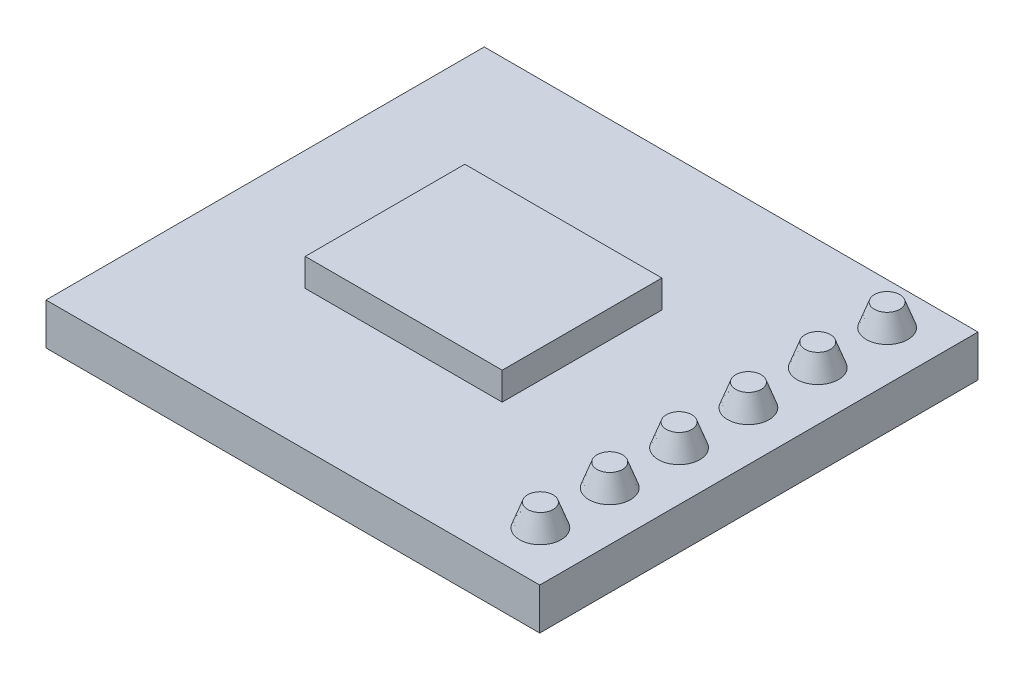
ISO-10303-21;
HEADER;
FILE_DESCRIPTION(('STEP AP214'),'2;1');
FILE_NAME('part.step','',(''),(''),'','','');
FILE_SCHEMA(('AUTOMOTIVE_DESIGN { 1 0 10303 214 1 1 1 1 }'));
ENDSEC;
DATA;
#1=APPLICATION_CONTEXT('core data for automotive mechanical design processes');
#2=APPLICATION_PROTOCOL_DEFINITION('international standard','automotive_design',2000,#1);
#3=PRODUCT_CONTEXT('',#1,'mechanical');
#4=PRODUCT('Part','Part','',(#3));
#5=PRODUCT_RELATED_PRODUCT_CATEGORY('part','',(#4));
#6=PRODUCT_DEFINITION_FORMATION('','',#4);
#7=PRODUCT_DEFINITION_CONTEXT('part definition',#1,'design');
#8=PRODUCT_DEFINITION('design','',#6,#7);
#9=PRODUCT_DEFINITION_SHAPE('','',#8);
#10=(LENGTH_UNIT() NAMED_UNIT(*) SI_UNIT(.MILLI.,.METRE.));
#11=(NAMED_UNIT(*) PLANE_ANGLE_UNIT() SI_UNIT($,.RADIAN.));
#12=(NAMED_UNIT(*) SI_UNIT($,.STERADIAN.) SOLID_ANGLE_UNIT());
#13=UNCERTAINTY_MEASURE_WITH_UNIT(LENGTH_MEASURE(1.E-05),#10,'distance_accuracy_value','');
#14=(GEOMETRIC_REPRESENTATION_CONTEXT(3) GLOBAL_UNCERTAINTY_ASSIGNED_CONTEXT((#13)) GLOBAL_UNIT_ASSIGNED_CONTEXT((#10,
#11,#12)) REPRESENTATION_CONTEXT('',''));
#15=CARTESIAN_POINT('',(0.,0.,0.));
#16=DIRECTION('',(0.,0.,1.));
#17=DIRECTION('',(1.,0.,0.));
#18=AXIS2_PLACEMENT_3D('',#15,#16,#17);
#19=CARTESIAN_POINT('',(8.9,1.5,-7.9));
#20=DIRECTION('',(-1.,0.,0.));
#21=DIRECTION('',(0.,0.,1.));
#22=AXIS2_PLACEMENT_3D('',#19,#20,#21);
#23=PLANE('',#22);
#24=DIRECTION('',(0.,0.,-1.));
#25=VECTOR('',#24,1.);
#26=CARTESIAN_POINT('',(8.9,0.,-7.9));
#27=LINE('',#26,#25);
#28=CARTESIAN_POINT('',(8.9,0.,7.9));
#29=VERTEX_POINT('',#28);
#30=CARTESIAN_POINT('',(8.9,0.,-7.9));
#31=VERTEX_POINT('',#30);
#32=EDGE_CURVE('E127',#29,#31,#27,.T.);
#33=ORIENTED_EDGE('',*,*,#32,.T.);
#34=DIRECTION('',(0.,-1.,0.));
#35=VECTOR('',#34,1.);
#36=CARTESIAN_POINT('',(8.9,1.5,-7.9));
#37=LINE('',#36,#35);
#38=CARTESIAN_POINT('',(8.9,1.5,-7.9));
#39=VERTEX_POINT('',#38);
#40=EDGE_CURVE('E11',#39,#31,#37,.T.);
#41=ORIENTED_EDGE('',*,*,#40,.F.);
#42=DIRECTION('',(0.,0.,-1.));
#43=VECTOR('',#42,1.);
#44=CARTESIAN_POINT('',(8.9,1.5,-7.9));
#45=LINE('',#44,#43);
#46=CARTESIAN_POINT('',(8.9,1.5,7.9));
#47=VERTEX_POINT('',#46);
#48=EDGE_CURVE('E138',#47,#39,#45,.T.);
#49=ORIENTED_EDGE('',*,*,#48,.F.);
#50=DIRECTION('',(0.,-1.,0.));
#51=VECTOR('',#50,1.);
#52=CARTESIAN_POINT('',(8.9,1.5,7.9));
#53=LINE('',#52,#51);
#54=EDGE_CURVE('E151',#47,#29,#53,.T.);
#55=ORIENTED_EDGE('',*,*,#54,.T.);
#56=EDGE_LOOP('',(#33,#41,#49,#55));
#57=FACE_BOUND('',#56,.T.);
#58=ADVANCED_FACE('F39',(#57),#23,.F.);
#59=CARTESIAN_POINT('',(-8.9,1.5,-7.9));
#60=DIRECTION('',(0.,0.,1.));
#61=DIRECTION('',(1.,0.,0.));
#62=AXIS2_PLACEMENT_3D('',#59,#60,#61);
#63=PLANE('',#62);
#64=DIRECTION('',(-1.,0.,0.));
#65=VECTOR('',#64,1.);
#66=CARTESIAN_POINT('',(-8.9,0.,-7.9));
#67=LINE('',#66,#65);
#68=CARTESIAN_POINT('',(-8.9,0.,-7.9));
#69=VERTEX_POINT('',#68);
#70=EDGE_CURVE('E132',#31,#69,#67,.T.);
#71=ORIENTED_EDGE('',*,*,#70,.T.);
#72=DIRECTION('',(0.,-1.,0.));
#73=VECTOR('',#72,1.);
#74=CARTESIAN_POINT('',(-8.9,1.5,-7.9));
#75=LINE('',#74,#73);
#76=CARTESIAN_POINT('',(-8.9,1.5,-7.9));
#77=VERTEX_POINT('',#76);
#78=EDGE_CURVE('E47',#77,#69,#75,.T.);
#79=ORIENTED_EDGE('',*,*,#78,.F.);
#80=DIRECTION('',(-1.,0.,0.));
#81=VECTOR('',#80,1.);
#82=CARTESIAN_POINT('',(-8.9,1.5,-7.9));
#83=LINE('',#82,#81);
#84=EDGE_CURVE('E142',#39,#77,#83,.T.);
#85=ORIENTED_EDGE('',*,*,#84,.F.);
#86=ORIENTED_EDGE('',*,*,#40,.T.);
#87=EDGE_LOOP('',(#71,#79,#85,#86));
#88=FACE_BOUND('',#87,.T.);
#89=ADVANCED_FACE('F188',(#88),#63,.F.);
#90=CARTESIAN_POINT('',(-8.9,1.5,-7.9));
#91=DIRECTION('',(1.,0.,0.));
#92=DIRECTION('',(0.,0.,-1.));
#93=AXIS2_PLACEMENT_3D('',#90,#91,#92);
#94=PLANE('',#93);
#95=DIRECTION('',(0.,0.,1.));
#96=VECTOR('',#95,1.);
#97=CARTESIAN_POINT('',(-8.9,0.,-7.9));
#98=LINE('',#97,#96);
#99=CARTESIAN_POINT('',(-8.9,0.,7.9));
#100=VERTEX_POINT('',#99);
#101=EDGE_CURVE('E155',#69,#100,#98,.T.);
#102=ORIENTED_EDGE('',*,*,#101,.T.);
#103=DIRECTION('',(0.,-1.,0.));
#104=VECTOR('',#103,1.);
#105=CARTESIAN_POINT('',(-8.9,1.5,7.9));
#106=LINE('',#105,#104);
#107=CARTESIAN_POINT('',(-8.9,1.5,7.9));
#108=VERTEX_POINT('',#107);
#109=EDGE_CURVE('E163',#108,#100,#106,.T.);
#110=ORIENTED_EDGE('',*,*,#109,.F.);
#111=DIRECTION('',(0.,0.,1.));
#112=VECTOR('',#111,1.);
#113=CARTESIAN_POINT('',(-8.9,1.5,-7.9));
#114=LINE('',#113,#112);
#115=EDGE_CURVE('E146',#77,#108,#114,.T.);
#116=ORIENTED_EDGE('',*,*,#115,.F.);
#117=ORIENTED_EDGE('',*,*,#78,.T.);
#118=EDGE_LOOP('',(#102,#110,#116,#117));
#119=FACE_BOUND('',#118,.T.);
#120=ADVANCED_FACE('F172',(#119),#94,.F.);
#121=CARTESIAN_POINT('',(-8.9,1.5,7.9));
#122=DIRECTION('',(0.,0.,-1.));
#123=DIRECTION('',(-1.,0.,0.));
#124=AXIS2_PLACEMENT_3D('',#121,#122,#123);
#125=PLANE('',#124);
#126=DIRECTION('',(1.,0.,0.));
#127=VECTOR('',#126,1.);
#128=CARTESIAN_POINT('',(-8.9,0.,7.9));
#129=LINE('',#128,#127);
#130=EDGE_CURVE('E143',#100,#29,#129,.T.);
#131=ORIENTED_EDGE('',*,*,#130,.T.);
#132=ORIENTED_EDGE('',*,*,#54,.F.);
#133=DIRECTION('',(1.,0.,0.));
#134=VECTOR('',#133,1.);
#135=CARTESIAN_POINT('',(-8.9,1.5,7.9));
#136=LINE('',#135,#134);
#137=EDGE_CURVE('E149',#108,#47,#136,.T.);
#138=ORIENTED_EDGE('',*,*,#137,.F.);
#139=ORIENTED_EDGE('',*,*,#109,.T.);
#140=EDGE_LOOP('',(#131,#132,#138,#139));
#141=FACE_BOUND('',#140,.T.);
#142=ADVANCED_FACE('F181',(#141),#125,.F.);
#143=CARTESIAN_POINT('',(0.,1.5,0.));
#144=DIRECTION('',(0.,1.,0.));
#145=DIRECTION('',(0.,0.,1.));
#146=AXIS2_PLACEMENT_3D('',#143,#144,#145);
#147=PLANE('',#146);
#148=CARTESIAN_POINT('',(7.12329912022585,1.5,6.1));
#149=DIRECTION('',(0.,1.,0.));
#150=DIRECTION('',(0.,0.,1.));
#151=AXIS2_PLACEMENT_3D('',#148,#149,#150);
#152=CIRCLE('',#151,0.75);
#153=CARTESIAN_POINT('',(7.12329912022585,1.5,6.85));
#154=VERTEX_POINT('',#153);
#155=EDGE_CURVE('E271',#154,#154,#152,.T.);
#156=ORIENTED_EDGE('',*,*,#155,.F.);
#157=EDGE_LOOP('',(#156));
#158=FACE_BOUND('',#157,.T.);
#159=CARTESIAN_POINT('',(7.12329912022585,1.5,3.6));
#160=DIRECTION('',(0.,1.,0.));
#161=DIRECTION('',(0.,0.,1.));
#162=AXIS2_PLACEMENT_3D('',#159,#160,#161);
#163=CIRCLE('',#162,0.75);
#164=CARTESIAN_POINT('',(7.12329912022585,1.5,4.35));
#165=VERTEX_POINT('',#164);
#166=EDGE_CURVE('E270',#165,#165,#163,.T.);
#167=ORIENTED_EDGE('',*,*,#166,.F.);
#168=EDGE_LOOP('',(#167));
#169=FACE_BOUND('',#168,.T.);
#170=CARTESIAN_POINT('',(7.12329912022585,1.5,1.1));
#171=DIRECTION('',(0.,1.,0.));
#172=DIRECTION('',(0.,0.,1.));
#173=AXIS2_PLACEMENT_3D('',#170,#171,#172);
#174=CIRCLE('',#173,0.75);
#175=CARTESIAN_POINT('',(7.12329912022585,1.5,1.85));
#176=VERTEX_POINT('',#175);
#177=EDGE_CURVE('E284',#176,#176,#174,.T.);
#178=ORIENTED_EDGE('',*,*,#177,.F.);
#179=EDGE_LOOP('',(#178));
#180=FACE_BOUND('',#179,.T.);
#181=CARTESIAN_POINT('',(7.12329912022585,1.5,-1.4));
#182=DIRECTION('',(0.,1.,0.));
#183=DIRECTION('',(0.,0.,1.));
#184=AXIS2_PLACEMENT_3D('',#181,#182,#183);
#185=CIRCLE('',#184,0.75);
#186=CARTESIAN_POINT('',(7.12329912022585,1.5,-0.650000000000001));
#187=VERTEX_POINT('',#186);
#188=EDGE_CURVE('E292',#187,#187,#185,.T.);
#189=ORIENTED_EDGE('',*,*,#188,.F.);
#190=EDGE_LOOP('',(#189));
#191=FACE_BOUND('',#190,.T.);
#192=CARTESIAN_POINT('',(7.12329912022585,1.5,-3.9));
#193=DIRECTION('',(0.,1.,0.));
#194=DIRECTION('',(0.,0.,1.));
#195=AXIS2_PLACEMENT_3D('',#192,#193,#194);
#196=CIRCLE('',#195,0.75);
#197=CARTESIAN_POINT('',(7.12329912022585,1.5,-3.15));
#198=VERTEX_POINT('',#197);
#199=EDGE_CURVE('E300',#198,#198,#196,.T.);
#200=ORIENTED_EDGE('',*,*,#199,.F.);
#201=EDGE_LOOP('',(#200));
#202=FACE_BOUND('',#201,.T.);
#203=CARTESIAN_POINT('',(7.12329912022585,1.5,-6.4));
#204=DIRECTION('',(0.,1.,0.));
#205=DIRECTION('',(0.,0.,1.));
#206=AXIS2_PLACEMENT_3D('',#203,#204,#205);
#207=CIRCLE('',#206,0.75);
#208=CARTESIAN_POINT('',(7.12329912022585,1.5,-5.65));
#209=VERTEX_POINT('',#208);
#210=EDGE_CURVE('E308',#209,#209,#207,.T.);
#211=ORIENTED_EDGE('',*,*,#210,.F.);
#212=EDGE_LOOP('',(#211));
#213=FACE_BOUND('',#212,.T.);
#214=DIRECTION('',(0.,0.,1.));
#215=VECTOR('',#214,1.);
#216=CARTESIAN_POINT('',(-4.58788756895902,1.5,-2.88755204449834));
#217=LINE('',#216,#215);
#218=CARTESIAN_POINT('',(-4.58788756895902,1.5,-2.88755204449834));
#219=VERTEX_POINT('',#218);
#220=CARTESIAN_POINT('',(-4.58788756895902,1.5,2.86742973059938));
#221=VERTEX_POINT('',#220);
#222=EDGE_CURVE('E54',#219,#221,#217,.T.);
#223=ORIENTED_EDGE('',*,*,#222,.F.);
#224=DIRECTION('',(-1.,0.,0.));
#225=VECTOR('',#224,1.);
#226=CARTESIAN_POINT('',(-4.58788756895902,1.5,-2.88755204449834));
#227=LINE('',#226,#225);
#228=CARTESIAN_POINT('',(2.51528923736789,1.5,-2.88755204449834));
#229=VERTEX_POINT('',#228);
#230=EDGE_CURVE('E58',#229,#219,#227,.T.);
#231=ORIENTED_EDGE('',*,*,#230,.F.);
#232=DIRECTION('',(0.,0.,-1.));
#233=VECTOR('',#232,1.);
#234=CARTESIAN_POINT('',(2.51528923736789,1.5,-2.88755204449834));
#235=LINE('',#234,#233);
#236=CARTESIAN_POINT('',(2.51528923736789,1.5,2.86742973059938));
#237=VERTEX_POINT('',#236);
#238=EDGE_CURVE('E326',#237,#229,#235,.T.);
#239=ORIENTED_EDGE('',*,*,#238,.F.);
#240=DIRECTION('',(1.,0.,0.));
#241=VECTOR('',#240,1.);
#242=CARTESIAN_POINT('',(-4.58788756895902,1.5,2.86742973059938));
#243=LINE('',#242,#241);
#244=EDGE_CURVE('E323',#221,#237,#243,.T.);
#245=ORIENTED_EDGE('',*,*,#244,.F.);
#246=EDGE_LOOP('',(#223,#231,#239,#245));
#247=FACE_BOUND('',#246,.T.);
#248=ORIENTED_EDGE('',*,*,#48,.T.);
#249=ORIENTED_EDGE('',*,*,#84,.T.);
#250=ORIENTED_EDGE('',*,*,#115,.T.);
#251=ORIENTED_EDGE('',*,*,#137,.T.);
#252=EDGE_LOOP('',(#248,#249,#250,#251));
#253=FACE_BOUND('',#252,.T.);
#254=ADVANCED_FACE('F187',(#158,#169,#180,#191,#202,#213,#247,#253),#147,.T.);
#255=CARTESIAN_POINT('',(0.,0.,0.));
#256=DIRECTION('',(0.,1.,0.));
#257=DIRECTION('',(0.,0.,1.));
#258=AXIS2_PLACEMENT_3D('',#255,#256,#257);
#259=PLANE('',#258);
#260=ORIENTED_EDGE('',*,*,#32,.F.);
#261=ORIENTED_EDGE('',*,*,#130,.F.);
#262=ORIENTED_EDGE('',*,*,#101,.F.);
#263=ORIENTED_EDGE('',*,*,#70,.F.);
#264=EDGE_LOOP('',(#260,#261,#262,#263));
#265=FACE_BOUND('',#264,.T.);
#266=ADVANCED_FACE('F178',(#265),#259,.F.);
#267=CARTESIAN_POINT('',(-4.58788756895902,2.5,-2.88755204449834));
#268=DIRECTION('',(1.,0.,0.));
#269=DIRECTION('',(0.,0.,-1.));
#270=AXIS2_PLACEMENT_3D('',#267,#268,#269);
#271=PLANE('',#270);
#272=ORIENTED_EDGE('',*,*,#222,.T.);
#273=DIRECTION('',(0.,-1.,0.));
#274=VECTOR('',#273,1.);
#275=CARTESIAN_POINT('',(-4.58788756895902,2.5,2.86742973059938));
#276=LINE('',#275,#274);
#277=CARTESIAN_POINT('',(-4.58788756895902,2.5,2.86742973059938));
#278=VERTEX_POINT('',#277);
#279=EDGE_CURVE('E107',#278,#221,#276,.T.);
#280=ORIENTED_EDGE('',*,*,#279,.F.);
#281=DIRECTION('',(0.,0.,1.));
#282=VECTOR('',#281,1.);
#283=CARTESIAN_POINT('',(-4.58788756895902,2.5,-2.88755204449834));
#284=LINE('',#283,#282);
#285=CARTESIAN_POINT('',(-4.58788756895902,2.5,-2.88755204449834));
#286=VERTEX_POINT('',#285);
#287=EDGE_CURVE('E114',#286,#278,#284,.T.);
#288=ORIENTED_EDGE('',*,*,#287,.F.);
#289=DIRECTION('',(0.,-1.,0.));
#290=VECTOR('',#289,1.);
#291=CARTESIAN_POINT('',(-4.58788756895902,2.5,-2.88755204449834));
#292=LINE('',#291,#290);
#293=EDGE_CURVE('E320',#286,#219,#292,.T.);
#294=ORIENTED_EDGE('',*,*,#293,.T.);
#295=EDGE_LOOP('',(#272,#280,#288,#294));
#296=FACE_BOUND('',#295,.T.);
#297=ADVANCED_FACE('F125',(#296),#271,.F.);
#298=CARTESIAN_POINT('',(-4.58788756895902,2.5,2.86742973059938));
#299=DIRECTION('',(0.,0.,-1.));
#300=DIRECTION('',(-1.,0.,0.));
#301=AXIS2_PLACEMENT_3D('',#298,#299,#300);
#302=PLANE('',#301);
#303=ORIENTED_EDGE('',*,*,#244,.T.);
#304=DIRECTION('',(0.,-1.,0.));
#305=VECTOR('',#304,1.);
#306=CARTESIAN_POINT('',(2.51528923736789,2.5,2.86742973059938));
#307=LINE('',#306,#305);
#308=CARTESIAN_POINT('',(2.51528923736789,2.5,2.86742973059938));
#309=VERTEX_POINT('',#308);
#310=EDGE_CURVE('E109',#309,#237,#307,.T.);
#311=ORIENTED_EDGE('',*,*,#310,.F.);
#312=DIRECTION('',(1.,0.,0.));
#313=VECTOR('',#312,1.);
#314=CARTESIAN_POINT('',(-4.58788756895902,2.5,2.86742973059938));
#315=LINE('',#314,#313);
#316=EDGE_CURVE('E102',#278,#309,#315,.T.);
#317=ORIENTED_EDGE('',*,*,#316,.F.);
#318=ORIENTED_EDGE('',*,*,#279,.T.);
#319=EDGE_LOOP('',(#303,#311,#317,#318));
#320=FACE_BOUND('',#319,.T.);
#321=ADVANCED_FACE('F105',(#320),#302,.F.);
#322=CARTESIAN_POINT('',(2.51528923736789,2.5,-2.88755204449834));
#323=DIRECTION('',(-1.,0.,0.));
#324=DIRECTION('',(0.,0.,1.));
#325=AXIS2_PLACEMENT_3D('',#322,#323,#324);
#326=PLANE('',#325);
#327=ORIENTED_EDGE('',*,*,#238,.T.);
#328=DIRECTION('',(0.,-1.,0.));
#329=VECTOR('',#328,1.);
#330=CARTESIAN_POINT('',(2.51528923736789,2.5,-2.88755204449834));
#331=LINE('',#330,#329);
#332=CARTESIAN_POINT('',(2.51528923736789,2.5,-2.88755204449834));
#333=VERTEX_POINT('',#332);
#334=EDGE_CURVE('E134',#333,#229,#331,.T.);
#335=ORIENTED_EDGE('',*,*,#334,.F.);
#336=DIRECTION('',(0.,0.,-1.));
#337=VECTOR('',#336,1.);
#338=CARTESIAN_POINT('',(2.51528923736789,2.5,-2.88755204449834));
#339=LINE('',#338,#337);
#340=EDGE_CURVE('E113',#309,#333,#339,.T.);
#341=ORIENTED_EDGE('',*,*,#340,.F.);
#342=ORIENTED_EDGE('',*,*,#310,.T.);
#343=EDGE_LOOP('',(#327,#335,#341,#342));
#344=FACE_BOUND('',#343,.T.);
#345=ADVANCED_FACE('F207',(#344),#326,.F.);
#346=CARTESIAN_POINT('',(-4.58788756895902,2.5,-2.88755204449834));
#347=DIRECTION('',(0.,0.,1.));
#348=DIRECTION('',(1.,0.,0.));
#349=AXIS2_PLACEMENT_3D('',#346,#347,#348);
#350=PLANE('',#349);
#351=ORIENTED_EDGE('',*,*,#230,.T.);
#352=ORIENTED_EDGE('',*,*,#293,.F.);
#353=DIRECTION('',(-1.,0.,0.));
#354=VECTOR('',#353,1.);
#355=CARTESIAN_POINT('',(-4.58788756895902,2.5,-2.88755204449834));
#356=LINE('',#355,#354);
#357=EDGE_CURVE('E119',#333,#286,#356,.T.);
#358=ORIENTED_EDGE('',*,*,#357,.F.);
#359=ORIENTED_EDGE('',*,*,#334,.T.);
#360=EDGE_LOOP('',(#351,#352,#358,#359));
#361=FACE_BOUND('',#360,.T.);
#362=ADVANCED_FACE('F210',(#361),#350,.F.);
#363=CARTESIAN_POINT('',(0.,2.5,0.));
#364=DIRECTION('',(0.,1.,0.));
#365=DIRECTION('',(0.,0.,1.));
#366=AXIS2_PLACEMENT_3D('',#363,#364,#365);
#367=PLANE('',#366);
#368=ORIENTED_EDGE('',*,*,#287,.T.);
#369=ORIENTED_EDGE('',*,*,#316,.T.);
#370=ORIENTED_EDGE('',*,*,#340,.T.);
#371=ORIENTED_EDGE('',*,*,#357,.T.);
#372=EDGE_LOOP('',(#368,#369,#370,#371));
#373=FACE_BOUND('',#372,.T.);
#374=ADVANCED_FACE('F117',(#373),#367,.T.);
#375=CARTESIAN_POINT('',(7.12329912022585,1.5,-6.4));
#376=DIRECTION('',(0.,-1.,0.));
#377=DIRECTION('',(0.,0.,1.));
#378=AXIS2_PLACEMENT_3D('',#375,#376,#377);
#379=CONICAL_SURFACE('',#378,0.75,0.349065850398866);
#380=CARTESIAN_POINT('',(7.12329912022585,2.3,-6.4));
#381=DIRECTION('',(0.,1.,0.));
#382=DIRECTION('',(0.,0.,1.));
#383=AXIS2_PLACEMENT_3D('',#380,#381,#382);
#384=CIRCLE('',#383,0.458823812587038);
#385=CARTESIAN_POINT('',(7.12329912022585,2.3,-5.94117618741296));
#386=VERTEX_POINT('',#385);
#387=EDGE_CURVE('E312',#386,#386,#384,.T.);
#388=ORIENTED_EDGE('',*,*,#387,.F.);
#389=EDGE_LOOP('',(#388));
#390=FACE_BOUND('',#389,.T.);
#391=ORIENTED_EDGE('',*,*,#210,.T.);
#392=EDGE_LOOP('',(#391));
#393=FACE_BOUND('',#392,.T.);
#394=ADVANCED_FACE('F217',(#390,#393),#379,.T.);
#395=CARTESIAN_POINT('',(7.12329912022585,2.3,-6.4));
#396=DIRECTION('',(0.,1.,0.));
#397=DIRECTION('',(0.,0.,1.));
#398=AXIS2_PLACEMENT_3D('',#395,#396,#397);
#399=PLANE('',#398);
#400=ORIENTED_EDGE('',*,*,#387,.T.);
#401=EDGE_LOOP('',(#400));
#402=FACE_BOUND('',#401,.T.);
#403=ADVANCED_FACE('F220',(#402),#399,.T.);
#404=CARTESIAN_POINT('',(7.12329912022585,1.5,-3.9));
#405=DIRECTION('',(0.,-1.,0.));
#406=DIRECTION('',(0.,0.,1.));
#407=AXIS2_PLACEMENT_3D('',#404,#405,#406);
#408=CONICAL_SURFACE('',#407,0.75,0.349065850398866);
#409=CARTESIAN_POINT('',(7.12329912022585,2.3,-3.9));
#410=DIRECTION('',(0.,1.,0.));
#411=DIRECTION('',(0.,0.,1.));
#412=AXIS2_PLACEMENT_3D('',#409,#410,#411);
#413=CIRCLE('',#412,0.458823812587038);
#414=CARTESIAN_POINT('',(7.12329912022585,2.3,-3.44117618741296));
#415=VERTEX_POINT('',#414);
#416=EDGE_CURVE('E304',#415,#415,#413,.T.);
#417=ORIENTED_EDGE('',*,*,#416,.F.);
#418=EDGE_LOOP('',(#417));
#419=FACE_BOUND('',#418,.T.);
#420=ORIENTED_EDGE('',*,*,#199,.T.);
#421=EDGE_LOOP('',(#420));
#422=FACE_BOUND('',#421,.T.);
#423=ADVANCED_FACE('F224',(#419,#422),#408,.T.);
#424=CARTESIAN_POINT('',(7.12329912022585,2.3,-3.9));
#425=DIRECTION('',(0.,1.,0.));
#426=DIRECTION('',(0.,0.,1.));
#427=AXIS2_PLACEMENT_3D('',#424,#425,#426);
#428=PLANE('',#427);
#429=ORIENTED_EDGE('',*,*,#416,.T.);
#430=EDGE_LOOP('',(#429));
#431=FACE_BOUND('',#430,.T.);
#432=ADVANCED_FACE('F228',(#431),#428,.T.);
#433=CARTESIAN_POINT('',(7.12329912022585,1.5,-1.4));
#434=DIRECTION('',(0.,-1.,0.));
#435=DIRECTION('',(0.,0.,1.));
#436=AXIS2_PLACEMENT_3D('',#433,#434,#435);
#437=CONICAL_SURFACE('',#436,0.75,0.349065850398866);
#438=CARTESIAN_POINT('',(7.12329912022585,2.3,-1.4));
#439=DIRECTION('',(0.,1.,0.));
#440=DIRECTION('',(0.,0.,1.));
#441=AXIS2_PLACEMENT_3D('',#438,#439,#440);
#442=CIRCLE('',#441,0.458823812587038);
#443=CARTESIAN_POINT('',(7.12329912022585,2.3,-0.941176187412963));
#444=VERTEX_POINT('',#443);
#445=EDGE_CURVE('E296',#444,#444,#442,.T.);
#446=ORIENTED_EDGE('',*,*,#445,.F.);
#447=EDGE_LOOP('',(#446));
#448=FACE_BOUND('',#447,.T.);
#449=ORIENTED_EDGE('',*,*,#188,.T.);
#450=EDGE_LOOP('',(#449));
#451=FACE_BOUND('',#450,.T.);
#452=ADVANCED_FACE('F232',(#448,#451),#437,.T.);
#453=CARTESIAN_POINT('',(7.12329912022585,2.3,-1.4));
#454=DIRECTION('',(0.,1.,0.));
#455=DIRECTION('',(0.,0.,1.));
#456=AXIS2_PLACEMENT_3D('',#453,#454,#455);
#457=PLANE('',#456);
#458=ORIENTED_EDGE('',*,*,#445,.T.);
#459=EDGE_LOOP('',(#458));
#460=FACE_BOUND('',#459,.T.);
#461=ADVANCED_FACE('F236',(#460),#457,.T.);
#462=CARTESIAN_POINT('',(7.12329912022585,1.5,1.1));
#463=DIRECTION('',(0.,-1.,0.));
#464=DIRECTION('',(0.,0.,1.));
#465=AXIS2_PLACEMENT_3D('',#462,#463,#464);
#466=CONICAL_SURFACE('',#465,0.75,0.349065850398866);
#467=CARTESIAN_POINT('',(7.12329912022585,2.3,1.1));
#468=DIRECTION('',(0.,1.,0.));
#469=DIRECTION('',(0.,0.,1.));
#470=AXIS2_PLACEMENT_3D('',#467,#468,#469);
#471=CIRCLE('',#470,0.458823812587038);
#472=CARTESIAN_POINT('',(7.12329912022585,2.3,1.55882381258704));
#473=VERTEX_POINT('',#472);
#474=EDGE_CURVE('E288',#473,#473,#471,.T.);
#475=ORIENTED_EDGE('',*,*,#474,.F.);
#476=EDGE_LOOP('',(#475));
#477=FACE_BOUND('',#476,.T.);
#478=ORIENTED_EDGE('',*,*,#177,.T.);
#479=EDGE_LOOP('',(#478));
#480=FACE_BOUND('',#479,.T.);
#481=ADVANCED_FACE('F240',(#477,#480),#466,.T.);
#482=CARTESIAN_POINT('',(7.12329912022585,2.3,1.1));
#483=DIRECTION('',(0.,1.,0.));
#484=DIRECTION('',(0.,0.,1.));
#485=AXIS2_PLACEMENT_3D('',#482,#483,#484);
#486=PLANE('',#485);
#487=ORIENTED_EDGE('',*,*,#474,.T.);
#488=EDGE_LOOP('',(#487));
#489=FACE_BOUND('',#488,.T.);
#490=ADVANCED_FACE('F244',(#489),#486,.T.);
#491=CARTESIAN_POINT('',(7.12329912022585,1.5,3.6));
#492=DIRECTION('',(0.,-1.,0.));
#493=DIRECTION('',(0.,0.,1.));
#494=AXIS2_PLACEMENT_3D('',#491,#492,#493);
#495=CONICAL_SURFACE('',#494,0.75,0.349065850398866);
#496=CARTESIAN_POINT('',(7.12329912022585,2.3,3.6));
#497=DIRECTION('',(0.,1.,0.));
#498=DIRECTION('',(0.,0.,1.));
#499=AXIS2_PLACEMENT_3D('',#496,#497,#498);
#500=CIRCLE('',#499,0.458823812587038);
#501=CARTESIAN_POINT('',(7.12329912022585,2.3,4.05882381258704));
#502=VERTEX_POINT('',#501);
#503=EDGE_CURVE('E276',#502,#502,#500,.T.);
#504=ORIENTED_EDGE('',*,*,#503,.F.);
#505=EDGE_LOOP('',(#504));
#506=FACE_BOUND('',#505,.T.);
#507=ORIENTED_EDGE('',*,*,#166,.T.);
#508=EDGE_LOOP('',(#507));
#509=FACE_BOUND('',#508,.T.);
#510=ADVANCED_FACE('F248',(#506,#509),#495,.T.);
#511=CARTESIAN_POINT('',(7.12329912022585,2.3,3.6));
#512=DIRECTION('',(0.,1.,0.));
#513=DIRECTION('',(0.,0.,1.));
#514=AXIS2_PLACEMENT_3D('',#511,#512,#513);
#515=PLANE('',#514);
#516=ORIENTED_EDGE('',*,*,#503,.T.);
#517=EDGE_LOOP('',(#516));
#518=FACE_BOUND('',#517,.T.);
#519=ADVANCED_FACE('F252',(#518),#515,.T.);
#520=CARTESIAN_POINT('',(7.12329912022585,1.5,6.1));
#521=DIRECTION('',(0.,-1.,0.));
#522=DIRECTION('',(0.,0.,1.));
#523=AXIS2_PLACEMENT_3D('',#520,#521,#522);
#524=CONICAL_SURFACE('',#523,0.75,0.349065850398866);
#525=CARTESIAN_POINT('',(7.12329912022585,2.3,6.1));
#526=DIRECTION('',(0.,1.,0.));
#527=DIRECTION('',(0.,0.,1.));
#528=AXIS2_PLACEMENT_3D('',#525,#526,#527);
#529=CIRCLE('',#528,0.458823812587038);
#530=CARTESIAN_POINT('',(7.12329912022585,2.3,6.55882381258704));
#531=VERTEX_POINT('',#530);
#532=EDGE_CURVE('E268',#531,#531,#529,.T.);
#533=ORIENTED_EDGE('',*,*,#532,.F.);
#534=EDGE_LOOP('',(#533));
#535=FACE_BOUND('',#534,.T.);
#536=ORIENTED_EDGE('',*,*,#155,.T.);
#537=EDGE_LOOP('',(#536));
#538=FACE_BOUND('',#537,.T.);
#539=ADVANCED_FACE('F256',(#535,#538),#524,.T.);
#540=CARTESIAN_POINT('',(7.12329912022585,2.3,6.1));
#541=DIRECTION('',(0.,1.,0.));
#542=DIRECTION('',(0.,0.,1.));
#543=AXIS2_PLACEMENT_3D('',#540,#541,#542);
#544=PLANE('',#543);
#545=ORIENTED_EDGE('',*,*,#532,.T.);
#546=EDGE_LOOP('',(#545));
#547=FACE_BOUND('',#546,.T.);
#548=ADVANCED_FACE('F260',(#547),#544,.T.);
#549=CLOSED_SHELL('',(#58,#89,#120,#142,#254,#266,#297,#321,#345,#362,#374,#394,#403,#423,#432,
#452,#461,#481,#490,#510,#519,#539,#548));
#550=MANIFOLD_SOLID_BREP('B2',#549);
#551=ADVANCED_BREP_SHAPE_REPRESENTATION('',(#18,#550),#14);
#552=SHAPE_DEFINITION_REPRESENTATION(#9,#551);
ENDSEC;
END-ISO-10303-21;
